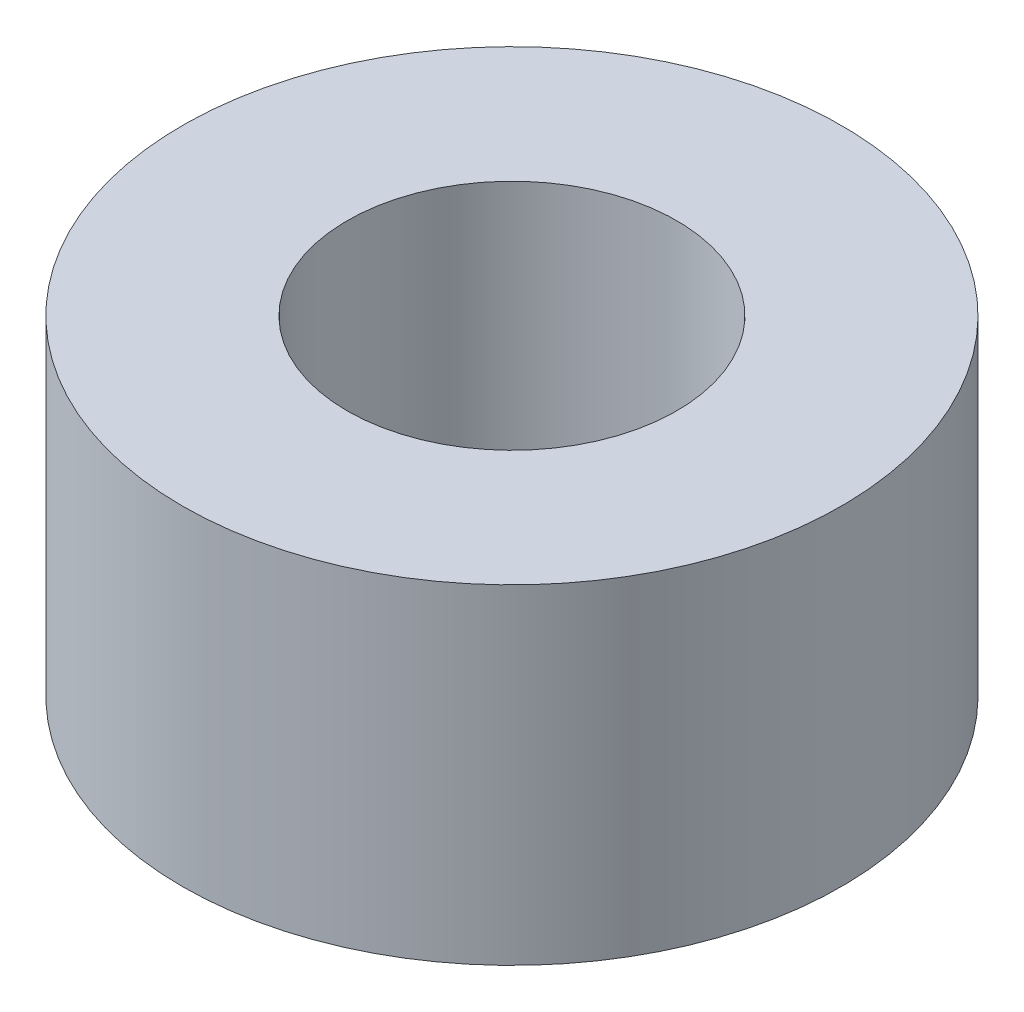
ISO-10303-21;
HEADER;
FILE_DESCRIPTION(('STEP AP214'),'2;1');
FILE_NAME('part.step','',(''),(''),'','','');
FILE_SCHEMA(('AUTOMOTIVE_DESIGN { 1 0 10303 214 1 1 1 1 }'));
ENDSEC;
DATA;
#1=APPLICATION_CONTEXT('core data for automotive mechanical design processes');
#2=APPLICATION_PROTOCOL_DEFINITION('international standard','automotive_design',2000,#1);
#3=PRODUCT_CONTEXT('',#1,'mechanical');
#4=PRODUCT('Part','Part','',(#3));
#5=PRODUCT_RELATED_PRODUCT_CATEGORY('part','',(#4));
#6=PRODUCT_DEFINITION_FORMATION('','',#4);
#7=PRODUCT_DEFINITION_CONTEXT('part definition',#1,'design');
#8=PRODUCT_DEFINITION('design','',#6,#7);
#9=PRODUCT_DEFINITION_SHAPE('','',#8);
#10=(LENGTH_UNIT() NAMED_UNIT(*) SI_UNIT(.MILLI.,.METRE.));
#11=(NAMED_UNIT(*) PLANE_ANGLE_UNIT() SI_UNIT($,.RADIAN.));
#12=(NAMED_UNIT(*) SI_UNIT($,.STERADIAN.) SOLID_ANGLE_UNIT());
#13=UNCERTAINTY_MEASURE_WITH_UNIT(LENGTH_MEASURE(1.E-05),#10,'distance_accuracy_value','');
#14=(GEOMETRIC_REPRESENTATION_CONTEXT(3) GLOBAL_UNCERTAINTY_ASSIGNED_CONTEXT((#13)) GLOBAL_UNIT_ASSIGNED_CONTEXT((#10,
#11,#12)) REPRESENTATION_CONTEXT('',''));
#15=CARTESIAN_POINT('',(0.,0.,0.));
#16=DIRECTION('',(0.,0.,1.));
#17=DIRECTION('',(1.,0.,0.));
#18=AXIS2_PLACEMENT_3D('',#15,#16,#17);
#19=CARTESIAN_POINT('',(0.,3.,0.));
#20=DIRECTION('',(0.,1.,0.));
#21=DIRECTION('',(0.,0.,1.));
#22=AXIS2_PLACEMENT_3D('',#19,#20,#21);
#23=PLANE('',#22);
#24=CARTESIAN_POINT('',(0.,3.,0.));
#25=DIRECTION('',(0.,1.,0.));
#26=DIRECTION('',(0.,0.,1.));
#27=AXIS2_PLACEMENT_3D('',#24,#25,#26);
#28=CIRCLE('',#27,3.);
#29=CARTESIAN_POINT('',(0.,3.,3.));
#30=VERTEX_POINT('',#29);
#31=EDGE_CURVE('E10',#30,#30,#28,.T.);
#32=ORIENTED_EDGE('',*,*,#31,.T.);
#33=EDGE_LOOP('',(#32));
#34=FACE_BOUND('',#33,.T.);
#35=CARTESIAN_POINT('',(0.,3.,0.));
#36=DIRECTION('',(0.,1.,0.));
#37=DIRECTION('',(0.,0.,1.));
#38=AXIS2_PLACEMENT_3D('',#35,#36,#37);
#39=CIRCLE('',#38,1.5);
#40=CARTESIAN_POINT('',(0.,3.,1.5));
#41=VERTEX_POINT('',#40);
#42=EDGE_CURVE('E44',#41,#41,#39,.T.);
#43=ORIENTED_EDGE('',*,*,#42,.F.);
#44=EDGE_LOOP('',(#43));
#45=FACE_BOUND('',#44,.T.);
#46=ADVANCED_FACE('F33',(#34,#45),#23,.T.);
#47=CARTESIAN_POINT('',(0.,0.,0.));
#48=DIRECTION('',(0.,1.,0.));
#49=DIRECTION('',(0.,0.,1.));
#50=AXIS2_PLACEMENT_3D('',#47,#48,#49);
#51=PLANE('',#50);
#52=CARTESIAN_POINT('',(0.,0.,0.));
#53=DIRECTION('',(0.,1.,0.));
#54=DIRECTION('',(0.,0.,1.));
#55=AXIS2_PLACEMENT_3D('',#52,#53,#54);
#56=CIRCLE('',#55,3.);
#57=CARTESIAN_POINT('',(0.,0.,3.));
#58=VERTEX_POINT('',#57);
#59=EDGE_CURVE('E37',#58,#58,#56,.T.);
#60=ORIENTED_EDGE('',*,*,#59,.F.);
#61=EDGE_LOOP('',(#60));
#62=FACE_BOUND('',#61,.T.);
#63=CARTESIAN_POINT('',(0.,0.,0.));
#64=DIRECTION('',(0.,1.,0.));
#65=DIRECTION('',(0.,0.,1.));
#66=AXIS2_PLACEMENT_3D('',#63,#64,#65);
#67=CIRCLE('',#66,1.5);
#68=CARTESIAN_POINT('',(0.,0.,1.5));
#69=VERTEX_POINT('',#68);
#70=EDGE_CURVE('E46',#69,#69,#67,.T.);
#71=ORIENTED_EDGE('',*,*,#70,.T.);
#72=EDGE_LOOP('',(#71));
#73=FACE_BOUND('',#72,.T.);
#74=ADVANCED_FACE('F56',(#62,#73),#51,.F.);
#75=CARTESIAN_POINT('',(0.,3.,0.));
#76=DIRECTION('',(0.,-1.,0.));
#77=DIRECTION('',(0.,0.,-1.));
#78=AXIS2_PLACEMENT_3D('',#75,#76,#77);
#79=CYLINDRICAL_SURFACE('',#78,3.);
#80=ORIENTED_EDGE('',*,*,#31,.F.);
#81=EDGE_LOOP('',(#80));
#82=FACE_BOUND('',#81,.T.);
#83=ORIENTED_EDGE('',*,*,#59,.T.);
#84=EDGE_LOOP('',(#83));
#85=FACE_BOUND('',#84,.T.);
#86=ADVANCED_FACE('F35',(#82,#85),#79,.T.);
#87=CARTESIAN_POINT('',(0.,3.,0.));
#88=DIRECTION('',(0.,-1.,0.));
#89=DIRECTION('',(0.,0.,-1.));
#90=AXIS2_PLACEMENT_3D('',#87,#88,#89);
#91=CYLINDRICAL_SURFACE('',#90,1.5);
#92=ORIENTED_EDGE('',*,*,#42,.T.);
#93=EDGE_LOOP('',(#92));
#94=FACE_BOUND('',#93,.T.);
#95=ORIENTED_EDGE('',*,*,#70,.F.);
#96=EDGE_LOOP('',(#95));
#97=FACE_BOUND('',#96,.T.);
#98=ADVANCED_FACE('F52',(#94,#97),#91,.F.);
#99=CLOSED_SHELL('',(#46,#74,#86,#98));
#100=MANIFOLD_SOLID_BREP('B2',#99);
#101=ADVANCED_BREP_SHAPE_REPRESENTATION('',(#18,#100),#14);
#102=SHAPE_DEFINITION_REPRESENTATION(#9,#101);
ENDSEC;
END-ISO-10303-21;
